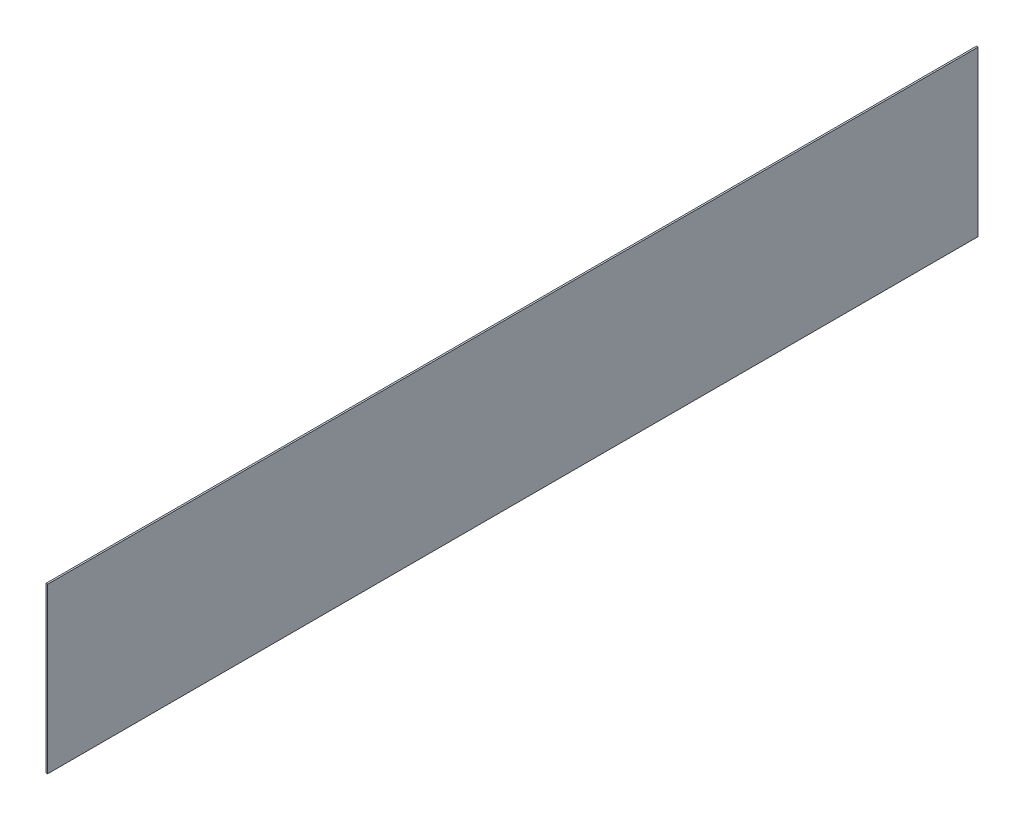
ISO-10303-21;
HEADER;
FILE_DESCRIPTION(('STEP AP214'),'2;1');
FILE_NAME('part.step','',(''),(''),'','','');
FILE_SCHEMA(('AUTOMOTIVE_DESIGN { 1 0 10303 214 1 1 1 1 }'));
ENDSEC;
DATA;
#1=APPLICATION_CONTEXT('core data for automotive mechanical design processes');
#2=APPLICATION_PROTOCOL_DEFINITION('international standard','automotive_design',2000,#1);
#3=PRODUCT_CONTEXT('',#1,'mechanical');
#4=PRODUCT('Part','Part','',(#3));
#5=PRODUCT_RELATED_PRODUCT_CATEGORY('part','',(#4));
#6=PRODUCT_DEFINITION_FORMATION('','',#4);
#7=PRODUCT_DEFINITION_CONTEXT('part definition',#1,'design');
#8=PRODUCT_DEFINITION('design','',#6,#7);
#9=PRODUCT_DEFINITION_SHAPE('','',#8);
#10=(LENGTH_UNIT() NAMED_UNIT(*) SI_UNIT(.MILLI.,.METRE.));
#11=(NAMED_UNIT(*) PLANE_ANGLE_UNIT() SI_UNIT($,.RADIAN.));
#12=(NAMED_UNIT(*) SI_UNIT($,.STERADIAN.) SOLID_ANGLE_UNIT());
#13=UNCERTAINTY_MEASURE_WITH_UNIT(LENGTH_MEASURE(1.E-05),#10,'distance_accuracy_value','');
#14=(GEOMETRIC_REPRESENTATION_CONTEXT(3) GLOBAL_UNCERTAINTY_ASSIGNED_CONTEXT((#13)) GLOBAL_UNIT_ASSIGNED_CONTEXT((#10,
#11,#12)) REPRESENTATION_CONTEXT('',''));
#15=CARTESIAN_POINT('',(0.,0.,0.));
#16=DIRECTION('',(0.,0.,1.));
#17=DIRECTION('',(1.,0.,0.));
#18=AXIS2_PLACEMENT_3D('',#15,#16,#17);
#19=CARTESIAN_POINT('',(1.2,0.,680.));
#20=DIRECTION('',(-1.,0.,0.));
#21=DIRECTION('',(0.,0.,1.));
#22=AXIS2_PLACEMENT_3D('',#19,#20,#21);
#23=PLANE('',#22);
#24=DIRECTION('',(0.,1.,0.));
#25=VECTOR('',#24,1.);
#26=CARTESIAN_POINT('',(1.2,0.,0.));
#27=LINE('',#26,#25);
#28=CARTESIAN_POINT('',(1.2,0.,0.));
#29=VERTEX_POINT('',#28);
#30=CARTESIAN_POINT('',(1.2,120.,0.));
#31=VERTEX_POINT('',#30);
#32=EDGE_CURVE('E106',#29,#31,#27,.T.);
#33=ORIENTED_EDGE('',*,*,#32,.T.);
#34=DIRECTION('',(0.,0.,-1.));
#35=VECTOR('',#34,1.);
#36=CARTESIAN_POINT('',(1.2,120.,680.));
#37=LINE('',#36,#35);
#38=CARTESIAN_POINT('',(1.2,120.,680.));
#39=VERTEX_POINT('',#38);
#40=EDGE_CURVE('E11',#39,#31,#37,.T.);
#41=ORIENTED_EDGE('',*,*,#40,.F.);
#42=DIRECTION('',(0.,1.,0.));
#43=VECTOR('',#42,1.);
#44=CARTESIAN_POINT('',(1.2,0.,680.));
#45=LINE('',#44,#43);
#46=CARTESIAN_POINT('',(1.2,0.,680.));
#47=VERTEX_POINT('',#46);
#48=EDGE_CURVE('E83',#47,#39,#45,.T.);
#49=ORIENTED_EDGE('',*,*,#48,.F.);
#50=DIRECTION('',(0.,0.,-1.));
#51=VECTOR('',#50,1.);
#52=CARTESIAN_POINT('',(1.2,0.,680.));
#53=LINE('',#52,#51);
#54=EDGE_CURVE('E59',#47,#29,#53,.T.);
#55=ORIENTED_EDGE('',*,*,#54,.T.);
#56=EDGE_LOOP('',(#33,#41,#49,#55));
#57=FACE_BOUND('',#56,.T.);
#58=ADVANCED_FACE('F43',(#57),#23,.F.);
#59=CARTESIAN_POINT('',(0.,120.,680.));
#60=DIRECTION('',(0.,1.,0.));
#61=DIRECTION('',(0.,0.,1.));
#62=AXIS2_PLACEMENT_3D('',#59,#60,#61);
#63=PLANE('',#62);
#64=DIRECTION('',(1.,0.,0.));
#65=VECTOR('',#64,1.);
#66=CARTESIAN_POINT('',(0.,120.,0.));
#67=LINE('',#66,#65);
#68=CARTESIAN_POINT('',(0.,120.,0.));
#69=VERTEX_POINT('',#68);
#70=EDGE_CURVE('E92',#69,#31,#67,.T.);
#71=ORIENTED_EDGE('',*,*,#70,.F.);
#72=DIRECTION('',(0.,0.,-1.));
#73=VECTOR('',#72,1.);
#74=CARTESIAN_POINT('',(0.,120.,680.));
#75=LINE('',#74,#73);
#76=CARTESIAN_POINT('',(0.,120.,680.));
#77=VERTEX_POINT('',#76);
#78=EDGE_CURVE('E51',#77,#69,#75,.T.);
#79=ORIENTED_EDGE('',*,*,#78,.F.);
#80=DIRECTION('',(1.,0.,0.));
#81=VECTOR('',#80,1.);
#82=CARTESIAN_POINT('',(0.,120.,680.));
#83=LINE('',#82,#81);
#84=EDGE_CURVE('E90',#77,#39,#83,.T.);
#85=ORIENTED_EDGE('',*,*,#84,.T.);
#86=ORIENTED_EDGE('',*,*,#40,.T.);
#87=EDGE_LOOP('',(#71,#79,#85,#86));
#88=FACE_BOUND('',#87,.T.);
#89=ADVANCED_FACE('F89',(#88),#63,.T.);
#90=CARTESIAN_POINT('',(0.,0.,680.));
#91=DIRECTION('',(-1.,0.,0.));
#92=DIRECTION('',(0.,0.,1.));
#93=AXIS2_PLACEMENT_3D('',#90,#91,#92);
#94=PLANE('',#93);
#95=DIRECTION('',(0.,1.,0.));
#96=VECTOR('',#95,1.);
#97=CARTESIAN_POINT('',(0.,0.,0.));
#98=LINE('',#97,#96);
#99=CARTESIAN_POINT('',(0.,0.,0.));
#100=VERTEX_POINT('',#99);
#101=EDGE_CURVE('E109',#100,#69,#98,.T.);
#102=ORIENTED_EDGE('',*,*,#101,.F.);
#103=DIRECTION('',(0.,0.,-1.));
#104=VECTOR('',#103,1.);
#105=CARTESIAN_POINT('',(0.,0.,680.));
#106=LINE('',#105,#104);
#107=CARTESIAN_POINT('',(0.,0.,680.));
#108=VERTEX_POINT('',#107);
#109=EDGE_CURVE('E72',#108,#100,#106,.T.);
#110=ORIENTED_EDGE('',*,*,#109,.F.);
#111=DIRECTION('',(0.,1.,0.));
#112=VECTOR('',#111,1.);
#113=CARTESIAN_POINT('',(0.,0.,680.));
#114=LINE('',#113,#112);
#115=EDGE_CURVE('E98',#108,#77,#114,.T.);
#116=ORIENTED_EDGE('',*,*,#115,.T.);
#117=ORIENTED_EDGE('',*,*,#78,.T.);
#118=EDGE_LOOP('',(#102,#110,#116,#117));
#119=FACE_BOUND('',#118,.T.);
#120=ADVANCED_FACE('F100',(#119),#94,.T.);
#121=CARTESIAN_POINT('',(1.2,0.,680.));
#122=DIRECTION('',(0.,-1.,0.));
#123=DIRECTION('',(0.,0.,-1.));
#124=AXIS2_PLACEMENT_3D('',#121,#122,#123);
#125=PLANE('',#124);
#126=DIRECTION('',(-1.,0.,0.));
#127=VECTOR('',#126,1.);
#128=CARTESIAN_POINT('',(1.2,0.,0.));
#129=LINE('',#128,#127);
#130=EDGE_CURVE('E111',#29,#100,#129,.T.);
#131=ORIENTED_EDGE('',*,*,#130,.F.);
#132=ORIENTED_EDGE('',*,*,#54,.F.);
#133=DIRECTION('',(-1.,0.,0.));
#134=VECTOR('',#133,1.);
#135=CARTESIAN_POINT('',(1.2,0.,680.));
#136=LINE('',#135,#134);
#137=EDGE_CURVE('E101',#47,#108,#136,.T.);
#138=ORIENTED_EDGE('',*,*,#137,.T.);
#139=ORIENTED_EDGE('',*,*,#109,.T.);
#140=EDGE_LOOP('',(#131,#132,#138,#139));
#141=FACE_BOUND('',#140,.T.);
#142=ADVANCED_FACE('F117',(#141),#125,.T.);
#143=CARTESIAN_POINT('',(0.,0.,680.));
#144=DIRECTION('',(0.,0.,-1.));
#145=DIRECTION('',(-1.,0.,0.));
#146=AXIS2_PLACEMENT_3D('',#143,#144,#145);
#147=PLANE('',#146);
#148=ORIENTED_EDGE('',*,*,#48,.T.);
#149=ORIENTED_EDGE('',*,*,#84,.F.);
#150=ORIENTED_EDGE('',*,*,#115,.F.);
#151=ORIENTED_EDGE('',*,*,#137,.F.);
#152=EDGE_LOOP('',(#148,#149,#150,#151));
#153=FACE_BOUND('',#152,.T.);
#154=ADVANCED_FACE('F97',(#153),#147,.F.);
#155=CARTESIAN_POINT('',(0.,0.,0.));
#156=DIRECTION('',(0.,0.,-1.));
#157=DIRECTION('',(-1.,0.,0.));
#158=AXIS2_PLACEMENT_3D('',#155,#156,#157);
#159=PLANE('',#158);
#160=ORIENTED_EDGE('',*,*,#32,.F.);
#161=ORIENTED_EDGE('',*,*,#130,.T.);
#162=ORIENTED_EDGE('',*,*,#101,.T.);
#163=ORIENTED_EDGE('',*,*,#70,.T.);
#164=EDGE_LOOP('',(#160,#161,#162,#163));
#165=FACE_BOUND('',#164,.T.);
#166=ADVANCED_FACE('F116',(#165),#159,.T.);
#167=CLOSED_SHELL('',(#58,#89,#120,#142,#154,#166));
#168=MANIFOLD_SOLID_BREP('B2',#167);
#169=ADVANCED_BREP_SHAPE_REPRESENTATION('',(#18,#168),#14);
#170=SHAPE_DEFINITION_REPRESENTATION(#9,#169);
ENDSEC;
END-ISO-10303-21;
